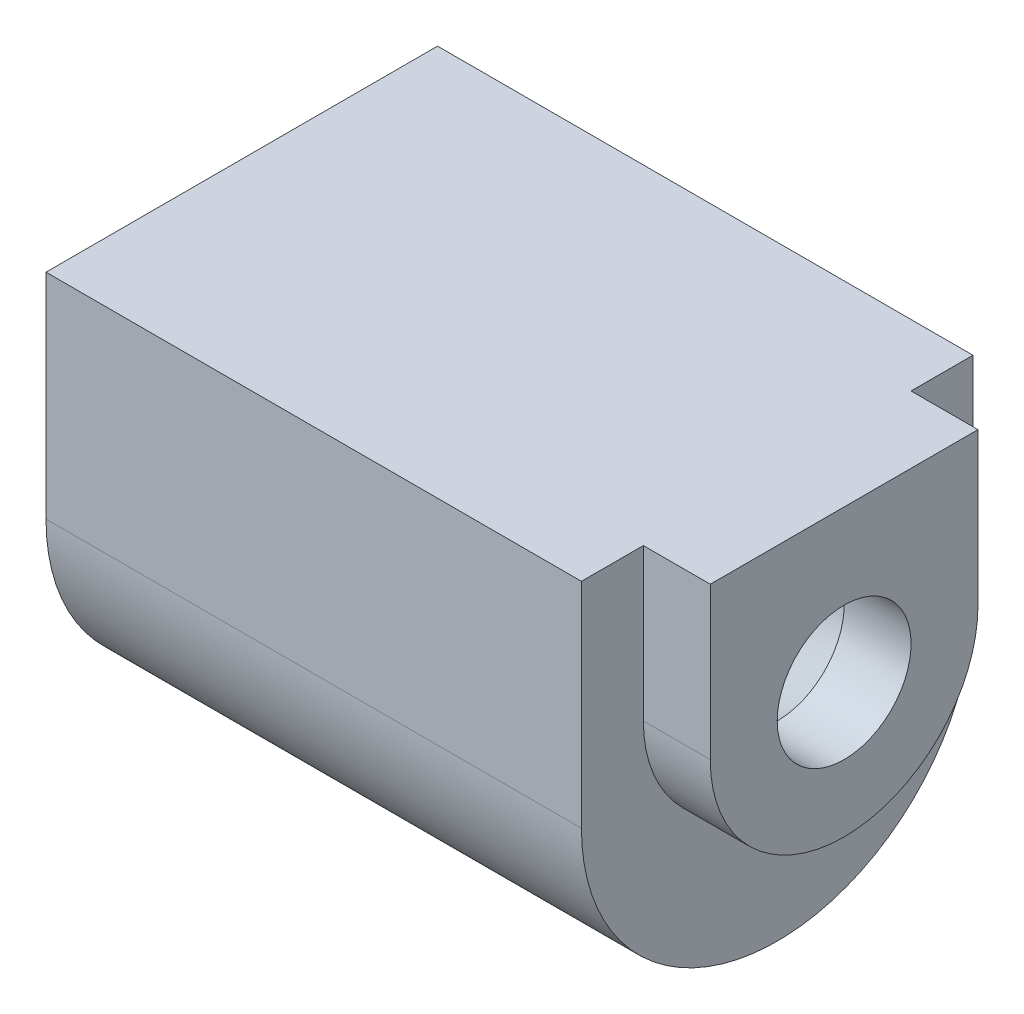
ISO-10303-21;
HEADER;
FILE_DESCRIPTION(('STEP AP214'),'2;1');
FILE_NAME('part.step','',(''),(''),'','','');
FILE_SCHEMA(('AUTOMOTIVE_DESIGN { 1 0 10303 214 1 1 1 1 }'));
ENDSEC;
DATA;
#1=APPLICATION_CONTEXT('core data for automotive mechanical design processes');
#2=APPLICATION_PROTOCOL_DEFINITION('international standard','automotive_design',2000,#1);
#3=PRODUCT_CONTEXT('',#1,'mechanical');
#4=PRODUCT('Part','Part','',(#3));
#5=PRODUCT_RELATED_PRODUCT_CATEGORY('part','',(#4));
#6=PRODUCT_DEFINITION_FORMATION('','',#4);
#7=PRODUCT_DEFINITION_CONTEXT('part definition',#1,'design');
#8=PRODUCT_DEFINITION('design','',#6,#7);
#9=PRODUCT_DEFINITION_SHAPE('','',#8);
#10=(LENGTH_UNIT() NAMED_UNIT(*) SI_UNIT(.MILLI.,.METRE.));
#11=(NAMED_UNIT(*) PLANE_ANGLE_UNIT() SI_UNIT($,.RADIAN.));
#12=(NAMED_UNIT(*) SI_UNIT($,.STERADIAN.) SOLID_ANGLE_UNIT());
#13=UNCERTAINTY_MEASURE_WITH_UNIT(LENGTH_MEASURE(1.E-05),#10,'distance_accuracy_value','');
#14=(GEOMETRIC_REPRESENTATION_CONTEXT(3) GLOBAL_UNCERTAINTY_ASSIGNED_CONTEXT((#13)) GLOBAL_UNIT_ASSIGNED_CONTEXT((#10,
#11,#12)) REPRESENTATION_CONTEXT('',''));
#15=CARTESIAN_POINT('',(0.,0.,0.));
#16=DIRECTION('',(0.,0.,1.));
#17=DIRECTION('',(1.,0.,0.));
#18=AXIS2_PLACEMENT_3D('',#15,#16,#17);
#19=CARTESIAN_POINT('',(-15.5,2.77,0.));
#20=DIRECTION('',(-1.,0.,0.));
#21=DIRECTION('',(0.,0.,1.));
#22=AXIS2_PLACEMENT_3D('',#19,#20,#21);
#23=CYLINDRICAL_SURFACE('',#22,1.);
#24=CARTESIAN_POINT('',(-20.5,2.77,0.));
#25=DIRECTION('',(-1.,0.,0.));
#26=DIRECTION('',(0.,0.,1.));
#27=AXIS2_PLACEMENT_3D('',#24,#25,#26);
#28=CIRCLE('',#27,1.);
#29=CARTESIAN_POINT('',(-20.5,2.77,1.));
#30=VERTEX_POINT('',#29);
#31=EDGE_CURVE('E273',#30,#30,#28,.T.);
#32=ORIENTED_EDGE('',*,*,#31,.F.);
#33=EDGE_LOOP('',(#32));
#34=FACE_BOUND('',#33,.T.);
#35=CARTESIAN_POINT('',(-21.5,2.77,0.));
#36=DIRECTION('',(1.,0.,0.));
#37=DIRECTION('',(0.,0.,1.));
#38=AXIS2_PLACEMENT_3D('',#35,#36,#37);
#39=CIRCLE('',#38,1.);
#40=CARTESIAN_POINT('',(-21.5,3.76726364007277,0.0739272087178636));
#41=VERTEX_POINT('',#40);
#42=EDGE_CURVE('E263',#41,#41,#39,.T.);
#43=ORIENTED_EDGE('',*,*,#42,.F.);
#44=EDGE_LOOP('',(#43));
#45=FACE_BOUND('',#44,.T.);
#46=ADVANCED_FACE('F63',(#34,#45),#23,.F.);
#47=CARTESIAN_POINT('',(-24.5,3.7694215432697,-0.0471881743603023));
#48=CARTESIAN_POINT('',(-21.5,3.76726364007277,0.0739272087178636));
#49=CARTESIAN_POINT('',(-24.5,3.77335389113306,0.11318028757884));
#50=CARTESIAN_POINT('',(-21.5,3.76110303934628,0.157032512057261));
#51=CARTESIAN_POINT('',(-24.5,3.75830135806429,0.295067265224581));
#52=CARTESIAN_POINT('',(-21.5,3.7440285629184,0.250292102146446));
#53=CARTESIAN_POINT('',(-24.5,3.65301338265531,0.692007504234672));
#54=CARTESIAN_POINT('',(-21.5,3.66931838913931,0.450115777032602));
#55=CARTESIAN_POINT('',(-24.5,3.56177045742842,0.907855701242654));
#56=CARTESIAN_POINT('',(-21.5,3.61112124696322,0.557039339440953));
#57=CARTESIAN_POINT('',(-24.5,3.26392982103547,1.32594907170451));
#58=CARTESIAN_POINT('',(-21.5,3.43578792669177,0.757960562594952));
#59=CARTESIAN_POINT('',(-24.5,3.05511935994576,1.52722508162609));
#60=CARTESIAN_POINT('',(-21.5,3.31755735714786,0.851344149820119));
#61=CARTESIAN_POINT('',(-24.5,2.5293741649439,1.82440053651075));
#62=CARTESIAN_POINT('',(-21.5,3.03058393577145,0.978111411454521));
#63=CARTESIAN_POINT('',(-24.5,2.21292509823859,1.91655684754299));
#64=CARTESIAN_POINT('',(-21.5,2.86228339796093,1.00958484152575));
#65=CARTESIAN_POINT('',(-24.5,1.57145125048202,1.93228623899642));
#66=CARTESIAN_POINT('',(-21.5,2.52986218460334,0.984942438619792));
#67=CARTESIAN_POINT('',(-24.5,1.25086573481317,1.85575046549752));
#68=CARTESIAN_POINT('',(-21.5,2.36804200188227,0.928997141302861));
#69=CARTESIAN_POINT('',(-24.5,0.71118723803941,1.58469995143518));
#70=CARTESIAN_POINT('',(-21.5,2.10289714501771,0.761301321208741));
#71=CARTESIAN_POINT('',(-24.5,0.492762798727094,1.39390004278334));
#72=CARTESIAN_POINT('',(-21.5,1.99972828498698,0.651505382041227));
#73=CARTESIAN_POINT('',(-24.5,0.174788541273744,0.990906888116786));
#74=CARTESIAN_POINT('',(-21.5,1.85593724043515,0.426927452097512));
#75=CARTESIAN_POINT('',(-24.5,0.0730761330954535,0.779790092057997));
#76=CARTESIAN_POINT('',(-21.5,1.81414208163327,0.31259145489505));
#77=CARTESIAN_POINT('',(-24.5,-0.0515401185315133,0.388487266944817));
#78=CARTESIAN_POINT('',(-21.5,1.76971249254501,0.1039359428074));
#79=CARTESIAN_POINT('',(-24.5,-0.075489195406344,0.207556636299444));
#80=CARTESIAN_POINT('',(-21.5,1.76657575920074,0.00917809462153286));
#81=CARTESIAN_POINT('',(-24.5,-0.083353891133061,-0.11318028757884));
#82=CARTESIAN_POINT('',(-21.5,1.77889696065372,-0.157032512057262));
#83=CARTESIAN_POINT('',(-24.5,-0.0683013580642926,-0.295067265224581));
#84=CARTESIAN_POINT('',(-21.5,1.79597143708159,-0.250292102146448));
#85=CARTESIAN_POINT('',(-24.5,0.0369866173446946,-0.692007504234672));
#86=CARTESIAN_POINT('',(-21.5,1.87068161086069,-0.450115777032603));
#87=CARTESIAN_POINT('',(-24.5,0.12822954257158,-0.907855701242654));
#88=CARTESIAN_POINT('',(-21.5,1.92887875303678,-0.557039339440953));
#89=CARTESIAN_POINT('',(-24.5,0.426070178964534,-1.32594907170451));
#90=CARTESIAN_POINT('',(-21.5,2.10421207330823,-0.757960562594952));
#91=CARTESIAN_POINT('',(-24.5,0.634880640054239,-1.52722508162609));
#92=CARTESIAN_POINT('',(-21.5,2.22244264285213,-0.851344149820119));
#93=CARTESIAN_POINT('',(-24.5,1.1606258350561,-1.82440053651075));
#94=CARTESIAN_POINT('',(-21.5,2.50941606422855,-0.978111411454522));
#95=CARTESIAN_POINT('',(-24.5,1.47707490176141,-1.91655684754299));
#96=CARTESIAN_POINT('',(-21.5,2.67771660203907,-1.00958484152575));
#97=CARTESIAN_POINT('',(-24.5,2.11854874951798,-1.93228623899642));
#98=CARTESIAN_POINT('',(-21.5,3.01013781539666,-0.984942438619791));
#99=CARTESIAN_POINT('',(-24.5,2.43913426518683,-1.85575046549752));
#100=CARTESIAN_POINT('',(-21.5,3.17195799811772,-0.928997141302861));
#101=CARTESIAN_POINT('',(-24.5,2.97881276196059,-1.58469995143518));
#102=CARTESIAN_POINT('',(-21.5,3.43710285498229,-0.761301321208741));
#103=CARTESIAN_POINT('',(-24.5,3.19723720127291,-1.39390004278334));
#104=CARTESIAN_POINT('',(-21.5,3.54027171501302,-0.651505382041227));
#105=CARTESIAN_POINT('',(-24.5,3.51521145872626,-0.990906888116786));
#106=CARTESIAN_POINT('',(-21.5,3.68406275956485,-0.426927452097512));
#107=CARTESIAN_POINT('',(-24.5,3.61692386690455,-0.779790092057997));
#108=CARTESIAN_POINT('',(-21.5,3.72585791836673,-0.312591454895051));
#109=CARTESIAN_POINT('',(-24.5,3.74154011853151,-0.388487266944817));
#110=CARTESIAN_POINT('',(-21.5,3.77028750745499,-0.1039359428074));
#111=CARTESIAN_POINT('',(-24.5,3.76548919540635,-0.207556636299444));
#112=CARTESIAN_POINT('',(-21.5,3.77342424079926,-0.00917809462153359));
#113=CARTESIAN_POINT('',(-24.5,3.7694215432697,-0.0471881743603023));
#114=CARTESIAN_POINT('',(-21.5,3.76726364007277,0.0739272087178636));
#115=B_SPLINE_SURFACE_WITH_KNOTS('',3,1,((#47,#48),(#49,#50),(#51,#52),(#53,#54),(#55,#56),(#57,
#58),(#59,#60),(#61,#62),(#63,#64),(#65,#66),(#67,#68),(#69,#70),(#71,#72),(#73,#74),(#75,#76),
(#77,#78),(#79,#80),(#81,#82),(#83,#84),(#85,#86),(#87,#88),(#89,#90),(#91,#92),(#93,#94),(#95,
#96),(#97,#98),(#99,#100),(#101,#102),(#103,#104),(#105,#106),(#107,#108),(#109,#110),(#111,
#112),(#113,#114)),.UNSPECIFIED.,.T.,.F.,.F.,(4,2,2,2,2,2,2,2,2,2,2,2,2,2,2,2,4),(2,2),(0.,
0.0625,0.125,0.1875,0.25,0.3125,0.375,0.4375,0.5,0.5625,0.625,0.6875,0.75,0.8125,0.875,0.9375,
1.),(0.,1.),.UNSPECIFIED.);
#116=CARTESIAN_POINT('',(-24.5,1.845,0.));
#117=DIRECTION('',(-1.,0.,0.));
#118=DIRECTION('',(0.,0.,1.));
#119=AXIS2_PLACEMENT_3D('',#116,#117,#118);
#120=CIRCLE('',#119,1.925);
#121=CARTESIAN_POINT('',(-24.5,3.7694215432697,-0.0471881743603023));
#122=VERTEX_POINT('',#121);
#123=EDGE_CURVE('E188',#122,#122,#120,.T.);
#124=CARTESIAN_POINT('',(-24.5,3.7694215432697,-0.0471881743603023));
#125=CARTESIAN_POINT('',(-24.46875,3.7693990651114,-0.0459265557865712));
#126=CARTESIAN_POINT('',(-24.4375,3.7693765869531,-0.0446649372128404));
#127=CARTESIAN_POINT('',(-24.375,3.7693316306365,-0.0421417000653787));
#128=CARTESIAN_POINT('',(-24.34375,3.7693091524782,-0.0408800814916479));
#129=CARTESIAN_POINT('',(-24.28125,3.76926419616159,-0.038356844344186));
#130=CARTESIAN_POINT('',(-24.25,3.76924171800329,-0.0370952257704551));
#131=CARTESIAN_POINT('',(-24.1875,3.76919676168669,-0.0345719886229933));
#132=CARTESIAN_POINT('',(-24.15625,3.76917428352839,-0.0333103700492624));
#133=CARTESIAN_POINT('',(-24.09375,3.76912932721179,-0.0307871329018007));
#134=CARTESIAN_POINT('',(-24.0625,3.76910684905348,-0.0295255143280697));
#135=CARTESIAN_POINT('',(-24.,3.76906189273688,-0.027002277180608));
#136=CARTESIAN_POINT('',(-23.96875,3.76903941457858,-0.0257406586068771));
#137=CARTESIAN_POINT('',(-23.90625,3.76899445826198,-0.0232174214594153));
#138=CARTESIAN_POINT('',(-23.875,3.76897198010368,-0.0219558028856843));
#139=CARTESIAN_POINT('',(-23.8125,3.76892702378707,-0.0194325657382225));
#140=CARTESIAN_POINT('',(-23.78125,3.76890454562877,-0.0181709471644917));
#141=CARTESIAN_POINT('',(-23.71875,3.76885958931217,-0.0156477100170299));
#142=CARTESIAN_POINT('',(-23.6875,3.76883711115387,-0.014386091443299));
#143=CARTESIAN_POINT('',(-23.625,3.76879215483726,-0.0118628542958372));
#144=CARTESIAN_POINT('',(-23.59375,3.76876967667896,-0.0106012357221064));
#145=CARTESIAN_POINT('',(-23.53125,3.76872472036236,-0.00807799857464457));
#146=CARTESIAN_POINT('',(-23.5,3.76870224220406,-0.00681638000091358));
#147=CARTESIAN_POINT('',(-23.4375,3.76865728588746,-0.00429314285345179));
#148=CARTESIAN_POINT('',(-23.40625,3.76863480772915,-0.00303152427972098));
#149=CARTESIAN_POINT('',(-23.34375,3.76858985141255,-0.000508287132259191));
#150=CARTESIAN_POINT('',(-23.3125,3.76856737325425,0.000753331441471794));
#151=CARTESIAN_POINT('',(-23.25,3.76852241693765,0.00327656858893358));
#152=CARTESIAN_POINT('',(-23.21875,3.76849993877934,0.00453818716266437));
#153=CARTESIAN_POINT('',(-23.15625,3.76845498246274,0.00706142431012617));
#154=CARTESIAN_POINT('',(-23.125,3.76843250430444,0.00832304288385716));
#155=CARTESIAN_POINT('',(-23.0625,3.76838754798784,0.010846280031319));
#156=CARTESIAN_POINT('',(-23.03125,3.76836506982954,0.0121078986050497));
#157=CARTESIAN_POINT('',(-22.96875,3.76832011351293,0.0146311357525115));
#158=CARTESIAN_POINT('',(-22.9375,3.76829763535463,0.0158927543262425));
#159=CARTESIAN_POINT('',(-22.875,3.76825267903803,0.0184159914737043));
#160=CARTESIAN_POINT('',(-22.84375,3.76823020087973,0.0196776100474351));
#161=CARTESIAN_POINT('',(-22.78125,3.76818524456313,0.0222008471948969));
#162=CARTESIAN_POINT('',(-22.75,3.76816276640482,0.0234624657686279));
#163=CARTESIAN_POINT('',(-22.6875,3.76811781008822,0.0259857029160897));
#164=CARTESIAN_POINT('',(-22.65625,3.76809533192992,0.0272473214898205));
#165=CARTESIAN_POINT('',(-22.59375,3.76805037561332,0.0297705586372823));
#166=CARTESIAN_POINT('',(-22.5625,3.76802789745502,0.0310321772110133));
#167=CARTESIAN_POINT('',(-22.5,3.76798294113841,0.0335554143584751));
#168=CARTESIAN_POINT('',(-22.46875,3.76796046298011,0.0348170329322059));
#169=CARTESIAN_POINT('',(-22.40625,3.76791550666351,0.0373402700796677));
#170=CARTESIAN_POINT('',(-22.375,3.76789302850521,0.0386018886533986));
#171=CARTESIAN_POINT('',(-22.3125,3.7678480721886,0.0411251258008604));
#172=CARTESIAN_POINT('',(-22.28125,3.7678255940303,0.0423867443745912));
#173=CARTESIAN_POINT('',(-22.21875,3.7677806377137,0.0449099815220531));
#174=CARTESIAN_POINT('',(-22.1875,3.7677581595554,0.046171600095784));
#175=CARTESIAN_POINT('',(-22.125,3.7677132032388,0.0486948372432458));
#176=CARTESIAN_POINT('',(-22.09375,3.76769072508049,0.0499564558169767));
#177=CARTESIAN_POINT('',(-22.03125,3.76764576876389,0.0524796929644384));
#178=CARTESIAN_POINT('',(-22.,3.76762329060559,0.0537413115381693));
#179=CARTESIAN_POINT('',(-21.9375,3.76757833428899,0.0562645486856311));
#180=CARTESIAN_POINT('',(-21.90625,3.76755585613069,0.057526167259362));
#181=CARTESIAN_POINT('',(-21.84375,3.76751089981408,0.0600494044068238));
#182=CARTESIAN_POINT('',(-21.8125,3.76748842165578,0.0613110229805547));
#183=CARTESIAN_POINT('',(-21.75,3.76744346533918,0.0638342601280165));
#184=CARTESIAN_POINT('',(-21.71875,3.76742098718088,0.0650958787017474));
#185=CARTESIAN_POINT('',(-21.65625,3.76737603086427,0.0676191158492092));
#186=CARTESIAN_POINT('',(-21.625,3.76735355270597,0.0688807344229401));
#187=CARTESIAN_POINT('',(-21.5625,3.76730859638937,0.0714039715704019));
#188=CARTESIAN_POINT('',(-21.53125,3.76728611823107,0.0726655901441327));
#189=CARTESIAN_POINT('',(-21.5,3.76726364007277,0.0739272087178636));
#190=B_SPLINE_CURVE_WITH_KNOTS('',3,(#124,#125,#126,#127,#128,#129,#130,#131,#132,#133,#134,
#135,#136,#137,#138,#139,#140,#141,#142,#143,#144,#145,#146,#147,#148,#149,#150,#151,#152,#153,
#154,#155,#156,#157,#158,#159,#160,#161,#162,#163,#164,#165,#166,#167,#168,#169,#170,#171,#172,
#173,#174,#175,#176,#177,#178,#179,#180,#181,#182,#183,#184,#185,#186,#187,#188,#189),
.UNSPECIFIED.,.F.,.F.,(4,2,2,2,2,2,2,2,2,2,2,2,2,2,2,2,2,2,2,2,2,2,2,2,2,2,2,2,2,2,2,2,4),(0.,
0.0938263938358393,0.187652787671685,0.281479181507525,0.375305575343371,0.469131969179214,
0.562958363015056,0.656784756850896,0.750611150686742,0.844437544522581,0.938263938358427,
1.03209033219427,1.12591672603011,1.21974311986595,1.3135695137018,1.40739590753764,
1.50122230137348,1.59504869520932,1.68887508904517,1.78270148288101,1.87652787671686,
1.97035427055269,2.06418066438854,2.15800705822438,2.25183345206023,2.34565984589607,
2.43948623973191,2.53331263356776,2.6271390274036,2.72096542123944,2.81479181507528,
2.90861820891113,3.00244460274697),.UNSPECIFIED.);
#191=EDGE_CURVE('BSEAM223',#122,#41,#190,.T.);
#192=ORIENTED_EDGE('',*,*,#123,.T.);
#193=ORIENTED_EDGE('',*,*,#42,.T.);
#194=ORIENTED_EDGE('',*,*,#191,.T.);
#195=ORIENTED_EDGE('',*,*,#191,.F.);
#196=EDGE_LOOP('',(#192,#194,#193,#195));
#197=FACE_BOUND('',#196,.T.);
#198=ADVANCED_FACE('F223',(#197),#115,.F.);
#199=CARTESIAN_POINT('',(-21.5,0.,0.));
#200=DIRECTION('',(-1.,0.,0.));
#201=DIRECTION('',(0.,0.,1.));
#202=AXIS2_PLACEMENT_3D('',#199,#200,#201);
#203=PLANE('',#202);
#204=CARTESIAN_POINT('',(-21.5,2.77,0.));
#205=DIRECTION('',(-1.,0.,0.));
#206=DIRECTION('',(0.,0.,1.));
#207=AXIS2_PLACEMENT_3D('',#204,#205,#206);
#208=CIRCLE('',#207,2.);
#209=CARTESIAN_POINT('',(-21.5,2.77,2.));
#210=VERTEX_POINT('',#209);
#211=CARTESIAN_POINT('',(-21.5,2.77,-2.));
#212=VERTEX_POINT('',#211);
#213=EDGE_CURVE('E137',#210,#212,#208,.F.);
#214=ORIENTED_EDGE('',*,*,#213,.F.);
#215=DIRECTION('',(0.,1.,0.));
#216=VECTOR('',#215,1.);
#217=CARTESIAN_POINT('',(-21.5,0.,1.99999999999999));
#218=LINE('',#217,#216);
#219=CARTESIAN_POINT('',(-21.5,5.04,2.));
#220=VERTEX_POINT('',#219);
#221=EDGE_CURVE('E261',#210,#220,#218,.T.);
#222=ORIENTED_EDGE('',*,*,#221,.T.);
#223=DIRECTION('',(0.,0.,-1.));
#224=VECTOR('',#223,1.);
#225=CARTESIAN_POINT('',(-21.5,5.04,-2.925));
#226=LINE('',#225,#224);
#227=CARTESIAN_POINT('',(-21.5,5.04,2.925));
#228=VERTEX_POINT('',#227);
#229=EDGE_CURVE('E156',#228,#220,#226,.T.);
#230=ORIENTED_EDGE('',*,*,#229,.F.);
#231=DIRECTION('',(0.,1.,0.));
#232=VECTOR('',#231,1.);
#233=CARTESIAN_POINT('',(-21.5,5.04,2.925));
#234=LINE('',#233,#232);
#235=CARTESIAN_POINT('',(-21.5,1.845,2.925));
#236=VERTEX_POINT('',#235);
#237=EDGE_CURVE('E142',#236,#228,#234,.T.);
#238=ORIENTED_EDGE('',*,*,#237,.F.);
#239=CARTESIAN_POINT('',(-21.5,1.845,0.));
#240=DIRECTION('',(-1.,0.,0.));
#241=DIRECTION('',(0.,0.,1.));
#242=AXIS2_PLACEMENT_3D('',#239,#240,#241);
#243=CIRCLE('',#242,2.925);
#244=CARTESIAN_POINT('',(-21.5,1.845,-2.925));
#245=VERTEX_POINT('',#244);
#246=EDGE_CURVE('E139',#245,#236,#243,.T.);
#247=ORIENTED_EDGE('',*,*,#246,.F.);
#248=DIRECTION('',(0.,-1.,0.));
#249=VECTOR('',#248,1.);
#250=CARTESIAN_POINT('',(-21.5,1.845,-2.925));
#251=LINE('',#250,#249);
#252=CARTESIAN_POINT('',(-21.5,5.04,-2.925));
#253=VERTEX_POINT('',#252);
#254=EDGE_CURVE('E159',#253,#245,#251,.T.);
#255=ORIENTED_EDGE('',*,*,#254,.F.);
#256=CARTESIAN_POINT('',(-21.5,5.04,-2.));
#257=VERTEX_POINT('',#256);
#258=EDGE_CURVE('E155',#257,#253,#226,.T.);
#259=ORIENTED_EDGE('',*,*,#258,.F.);
#260=DIRECTION('',(0.,-1.,0.));
#261=VECTOR('',#260,1.);
#262=CARTESIAN_POINT('',(-21.5,0.,-2.));
#263=LINE('',#262,#261);
#264=EDGE_CURVE('E147',#257,#212,#263,.T.);
#265=ORIENTED_EDGE('',*,*,#264,.T.);
#266=EDGE_LOOP('',(#214,#222,#230,#238,#247,#255,#259,#265));
#267=FACE_BOUND('',#266,.T.);
#268=ADVANCED_FACE('F220',(#267),#203,.F.);
#269=CARTESIAN_POINT('',(-29.5,0.,-2.925));
#270=DIRECTION('',(0.,0.,-1.));
#271=DIRECTION('',(0.,1.,0.));
#272=AXIS2_PLACEMENT_3D('',#269,#270,#271);
#273=PLANE('',#272);
#274=DIRECTION('',(1.,0.,0.));
#275=VECTOR('',#274,1.);
#276=CARTESIAN_POINT('',(-29.5,5.04,-2.925));
#277=LINE('',#276,#275);
#278=CARTESIAN_POINT('',(-29.5,5.04,-2.925));
#279=VERTEX_POINT('',#278);
#280=EDGE_CURVE('E176',#279,#253,#277,.T.);
#281=ORIENTED_EDGE('',*,*,#280,.T.);
#282=ORIENTED_EDGE('',*,*,#254,.T.);
#283=DIRECTION('',(1.,0.,0.));
#284=VECTOR('',#283,1.);
#285=CARTESIAN_POINT('',(-29.5,1.845,-2.925));
#286=LINE('',#285,#284);
#287=CARTESIAN_POINT('',(-29.5,1.845,-2.925));
#288=VERTEX_POINT('',#287);
#289=EDGE_CURVE('E71',#288,#245,#286,.T.);
#290=ORIENTED_EDGE('',*,*,#289,.F.);
#291=DIRECTION('',(0.,1.,0.));
#292=VECTOR('',#291,1.);
#293=CARTESIAN_POINT('',(-29.5,0.,-2.925));
#294=LINE('',#293,#292);
#295=EDGE_CURVE('E161',#288,#279,#294,.T.);
#296=ORIENTED_EDGE('',*,*,#295,.T.);
#297=EDGE_LOOP('',(#281,#282,#290,#296));
#298=FACE_BOUND('',#297,.T.);
#299=ADVANCED_FACE('F65',(#298),#273,.T.);
#300=CARTESIAN_POINT('',(-29.5,1.845,0.));
#301=DIRECTION('',(1.,0.,0.));
#302=DIRECTION('',(0.,0.,-1.));
#303=AXIS2_PLACEMENT_3D('',#300,#301,#302);
#304=CYLINDRICAL_SURFACE('',#303,2.925);
#305=ORIENTED_EDGE('',*,*,#289,.T.);
#306=ORIENTED_EDGE('',*,*,#246,.T.);
#307=DIRECTION('',(1.,0.,0.));
#308=VECTOR('',#307,1.);
#309=CARTESIAN_POINT('',(-29.5,1.845,2.925));
#310=LINE('',#309,#308);
#311=CARTESIAN_POINT('',(-29.5,1.845,2.925));
#312=VERTEX_POINT('',#311);
#313=EDGE_CURVE('E181',#312,#236,#310,.T.);
#314=ORIENTED_EDGE('',*,*,#313,.F.);
#315=CARTESIAN_POINT('',(-29.5,1.845,0.));
#316=DIRECTION('',(-1.,0.,0.));
#317=DIRECTION('',(0.,0.,1.));
#318=AXIS2_PLACEMENT_3D('',#315,#316,#317);
#319=CIRCLE('',#318,2.925);
#320=EDGE_CURVE('E165',#288,#312,#319,.T.);
#321=ORIENTED_EDGE('',*,*,#320,.F.);
#322=EDGE_LOOP('',(#305,#306,#314,#321));
#323=FACE_BOUND('',#322,.T.);
#324=ADVANCED_FACE('F213',(#323),#304,.T.);
#325=CARTESIAN_POINT('',(-29.5,0.,2.925));
#326=DIRECTION('',(0.,0.,1.));
#327=DIRECTION('',(0.,-1.,0.));
#328=AXIS2_PLACEMENT_3D('',#325,#326,#327);
#329=PLANE('',#328);
#330=ORIENTED_EDGE('',*,*,#313,.T.);
#331=ORIENTED_EDGE('',*,*,#237,.T.);
#332=DIRECTION('',(1.,0.,0.));
#333=VECTOR('',#332,1.);
#334=CARTESIAN_POINT('',(-29.5,5.04,2.925));
#335=LINE('',#334,#333);
#336=CARTESIAN_POINT('',(-29.5,5.04,2.925));
#337=VERTEX_POINT('',#336);
#338=EDGE_CURVE('E179',#337,#228,#335,.T.);
#339=ORIENTED_EDGE('',*,*,#338,.F.);
#340=DIRECTION('',(0.,-1.,0.));
#341=VECTOR('',#340,1.);
#342=CARTESIAN_POINT('',(-29.5,0.,2.925));
#343=LINE('',#342,#341);
#344=EDGE_CURVE('E167',#337,#312,#343,.T.);
#345=ORIENTED_EDGE('',*,*,#344,.T.);
#346=EDGE_LOOP('',(#330,#331,#339,#345));
#347=FACE_BOUND('',#346,.T.);
#348=ADVANCED_FACE('F210',(#347),#329,.T.);
#349=CARTESIAN_POINT('',(-29.5,5.04,0.));
#350=DIRECTION('',(0.,1.,0.));
#351=DIRECTION('',(0.,0.,1.));
#352=AXIS2_PLACEMENT_3D('',#349,#350,#351);
#353=PLANE('',#352);
#354=DIRECTION('',(0.,0.,1.));
#355=VECTOR('',#354,1.);
#356=CARTESIAN_POINT('',(-20.5,5.04,0.));
#357=LINE('',#356,#355);
#358=CARTESIAN_POINT('',(-20.5,5.04,-2.));
#359=VERTEX_POINT('',#358);
#360=CARTESIAN_POINT('',(-20.5,5.04,2.));
#361=VERTEX_POINT('',#360);
#362=EDGE_CURVE('E295',#359,#361,#357,.T.);
#363=ORIENTED_EDGE('',*,*,#362,.F.);
#364=DIRECTION('',(-1.,0.,0.));
#365=VECTOR('',#364,1.);
#366=CARTESIAN_POINT('',(-15.5,5.04,-2.));
#367=LINE('',#366,#365);
#368=EDGE_CURVE('E133',#359,#257,#367,.T.);
#369=ORIENTED_EDGE('',*,*,#368,.T.);
#370=ORIENTED_EDGE('',*,*,#258,.T.);
#371=ORIENTED_EDGE('',*,*,#280,.F.);
#372=DIRECTION('',(0.,0.,1.));
#373=VECTOR('',#372,1.);
#374=CARTESIAN_POINT('',(-29.5,5.04,0.));
#375=LINE('',#374,#373);
#376=EDGE_CURVE('E170',#279,#337,#375,.T.);
#377=ORIENTED_EDGE('',*,*,#376,.T.);
#378=ORIENTED_EDGE('',*,*,#338,.T.);
#379=ORIENTED_EDGE('',*,*,#229,.T.);
#380=DIRECTION('',(-1.,0.,0.));
#381=VECTOR('',#380,1.);
#382=CARTESIAN_POINT('',(-15.5,5.04,2.));
#383=LINE('',#382,#381);
#384=EDGE_CURVE('E144',#361,#220,#383,.T.);
#385=ORIENTED_EDGE('',*,*,#384,.F.);
#386=EDGE_LOOP('',(#363,#369,#370,#371,#377,#378,#379,#385));
#387=FACE_BOUND('',#386,.T.);
#388=ADVANCED_FACE('F205',(#387),#353,.T.);
#389=CARTESIAN_POINT('',(-29.5,1.845,0.));
#390=DIRECTION('',(1.,0.,0.));
#391=DIRECTION('',(0.,0.,-1.));
#392=AXIS2_PLACEMENT_3D('',#389,#390,#391);
#393=CYLINDRICAL_SURFACE('',#392,1.925);
#394=CARTESIAN_POINT('',(-29.5,1.845,0.));
#395=DIRECTION('',(-1.,0.,0.));
#396=DIRECTION('',(0.,0.,1.));
#397=AXIS2_PLACEMENT_3D('',#394,#395,#396);
#398=CIRCLE('',#397,1.925);
#399=CARTESIAN_POINT('',(-29.5,1.845,1.925));
#400=VERTEX_POINT('',#399);
#401=EDGE_CURVE('E173',#400,#400,#398,.T.);
#402=ORIENTED_EDGE('',*,*,#401,.T.);
#403=EDGE_LOOP('',(#402));
#404=FACE_BOUND('',#403,.T.);
#405=ORIENTED_EDGE('',*,*,#123,.F.);
#406=EDGE_LOOP('',(#405));
#407=FACE_BOUND('',#406,.T.);
#408=ADVANCED_FACE('F194',(#404,#407),#393,.F.);
#409=CARTESIAN_POINT('',(-29.5,0.,0.));
#410=DIRECTION('',(-1.,0.,0.));
#411=DIRECTION('',(0.,0.,1.));
#412=AXIS2_PLACEMENT_3D('',#409,#410,#411);
#413=PLANE('',#412);
#414=ORIENTED_EDGE('',*,*,#295,.F.);
#415=ORIENTED_EDGE('',*,*,#320,.T.);
#416=ORIENTED_EDGE('',*,*,#344,.F.);
#417=ORIENTED_EDGE('',*,*,#376,.F.);
#418=EDGE_LOOP('',(#414,#415,#416,#417));
#419=FACE_BOUND('',#418,.T.);
#420=ORIENTED_EDGE('',*,*,#401,.F.);
#421=EDGE_LOOP('',(#420));
#422=FACE_BOUND('',#421,.T.);
#423=ADVANCED_FACE('F204',(#419,#422),#413,.T.);
#424=CARTESIAN_POINT('',(-15.5,0.,1.99999999999999));
#425=DIRECTION('',(0.,0.,1.));
#426=DIRECTION('',(0.,-1.,0.));
#427=AXIS2_PLACEMENT_3D('',#424,#425,#426);
#428=PLANE('',#427);
#429=DIRECTION('',(0.,-1.,0.));
#430=VECTOR('',#429,1.);
#431=CARTESIAN_POINT('',(-20.5,0.,1.99999999999999));
#432=LINE('',#431,#430);
#433=CARTESIAN_POINT('',(-20.5,2.77,2.));
#434=VERTEX_POINT('',#433);
#435=EDGE_CURVE('E78',#361,#434,#432,.T.);
#436=ORIENTED_EDGE('',*,*,#435,.F.);
#437=ORIENTED_EDGE('',*,*,#384,.T.);
#438=ORIENTED_EDGE('',*,*,#221,.F.);
#439=DIRECTION('',(-1.,0.,0.));
#440=VECTOR('',#439,1.);
#441=CARTESIAN_POINT('',(-15.5,2.77,2.));
#442=LINE('',#441,#440);
#443=EDGE_CURVE('E151',#434,#210,#442,.T.);
#444=ORIENTED_EDGE('',*,*,#443,.F.);
#445=EDGE_LOOP('',(#436,#437,#438,#444));
#446=FACE_BOUND('',#445,.T.);
#447=ADVANCED_FACE('F248',(#446),#428,.T.);
#448=CARTESIAN_POINT('',(-15.5,0.,-2.));
#449=DIRECTION('',(0.,0.,-1.));
#450=DIRECTION('',(0.,1.,0.));
#451=AXIS2_PLACEMENT_3D('',#448,#449,#450);
#452=PLANE('',#451);
#453=DIRECTION('',(0.,1.,0.));
#454=VECTOR('',#453,1.);
#455=CARTESIAN_POINT('',(-20.5,0.,-2.));
#456=LINE('',#455,#454);
#457=CARTESIAN_POINT('',(-20.5,2.77,-2.));
#458=VERTEX_POINT('',#457);
#459=EDGE_CURVE('E127',#458,#359,#456,.T.);
#460=ORIENTED_EDGE('',*,*,#459,.F.);
#461=DIRECTION('',(-1.,0.,0.));
#462=VECTOR('',#461,1.);
#463=CARTESIAN_POINT('',(-15.5,2.77,-2.));
#464=LINE('',#463,#462);
#465=EDGE_CURVE('E85',#458,#212,#464,.T.);
#466=ORIENTED_EDGE('',*,*,#465,.T.);
#467=ORIENTED_EDGE('',*,*,#264,.F.);
#468=ORIENTED_EDGE('',*,*,#368,.F.);
#469=EDGE_LOOP('',(#460,#466,#467,#468));
#470=FACE_BOUND('',#469,.T.);
#471=ADVANCED_FACE('F132',(#470),#452,.T.);
#472=CARTESIAN_POINT('',(-15.5,2.77,0.));
#473=DIRECTION('',(-1.,0.,0.));
#474=DIRECTION('',(0.,0.,1.));
#475=AXIS2_PLACEMENT_3D('',#472,#473,#474);
#476=CYLINDRICAL_SURFACE('',#475,2.);
#477=ORIENTED_EDGE('',*,*,#465,.F.);
#478=CARTESIAN_POINT('',(-20.5,2.77,0.));
#479=DIRECTION('',(-1.,0.,0.));
#480=DIRECTION('',(0.,0.,1.));
#481=AXIS2_PLACEMENT_3D('',#478,#479,#480);
#482=CIRCLE('',#481,2.);
#483=EDGE_CURVE('E13',#458,#434,#482,.T.);
#484=ORIENTED_EDGE('',*,*,#483,.T.);
#485=ORIENTED_EDGE('',*,*,#443,.T.);
#486=ORIENTED_EDGE('',*,*,#213,.T.);
#487=EDGE_LOOP('',(#477,#484,#485,#486));
#488=FACE_BOUND('',#487,.T.);
#489=ADVANCED_FACE('F135',(#488),#476,.T.);
#490=CARTESIAN_POINT('',(-20.5,0.,0.));
#491=DIRECTION('',(-1.,0.,0.));
#492=DIRECTION('',(0.,0.,1.));
#493=AXIS2_PLACEMENT_3D('',#490,#491,#492);
#494=PLANE('',#493);
#495=ORIENTED_EDGE('',*,*,#31,.T.);
#496=EDGE_LOOP('',(#495));
#497=FACE_BOUND('',#496,.T.);
#498=ORIENTED_EDGE('',*,*,#362,.T.);
#499=ORIENTED_EDGE('',*,*,#435,.T.);
#500=ORIENTED_EDGE('',*,*,#483,.F.);
#501=ORIENTED_EDGE('',*,*,#459,.T.);
#502=EDGE_LOOP('',(#498,#499,#500,#501));
#503=FACE_BOUND('',#502,.T.);
#504=ADVANCED_FACE('F126',(#497,#503),#494,.F.);
#505=CLOSED_SHELL('',(#46,#198,#268,#299,#324,#348,#388,#408,#423,#447,#471,#489,#504));
#506=MANIFOLD_SOLID_BREP('B2',#505);
#507=ADVANCED_BREP_SHAPE_REPRESENTATION('',(#18,#506),#14);
#508=SHAPE_DEFINITION_REPRESENTATION(#9,#507);
ENDSEC;
END-ISO-10303-21;
